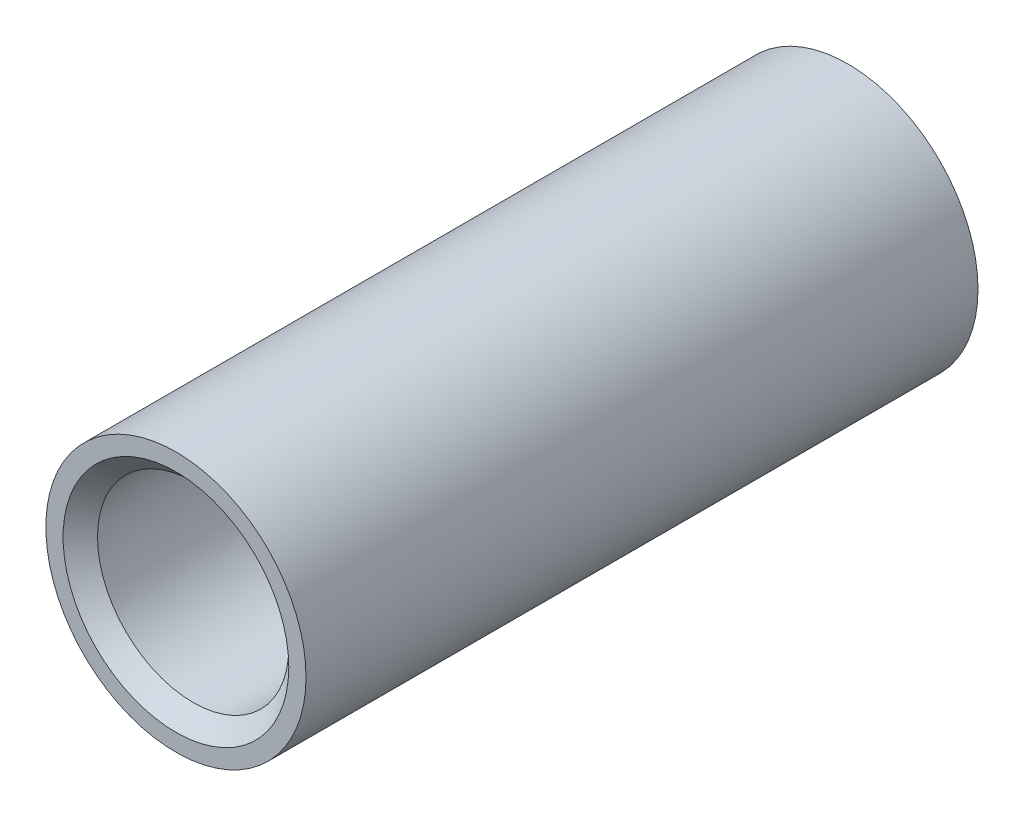
ISO-10303-21;
HEADER;
FILE_DESCRIPTION(('STEP AP214'),'2;1');
FILE_NAME('part.step','',(''),(''),'','','');
FILE_SCHEMA(('AUTOMOTIVE_DESIGN { 1 0 10303 214 1 1 1 1 }'));
ENDSEC;
DATA;
#1=APPLICATION_CONTEXT('core data for automotive mechanical design processes');
#2=APPLICATION_PROTOCOL_DEFINITION('international standard','automotive_design',2000,#1);
#3=PRODUCT_CONTEXT('',#1,'mechanical');
#4=PRODUCT('Part','Part','',(#3));
#5=PRODUCT_RELATED_PRODUCT_CATEGORY('part','',(#4));
#6=PRODUCT_DEFINITION_FORMATION('','',#4);
#7=PRODUCT_DEFINITION_CONTEXT('part definition',#1,'design');
#8=PRODUCT_DEFINITION('design','',#6,#7);
#9=PRODUCT_DEFINITION_SHAPE('','',#8);
#10=(LENGTH_UNIT() NAMED_UNIT(*) SI_UNIT(.MILLI.,.METRE.));
#11=(NAMED_UNIT(*) PLANE_ANGLE_UNIT() SI_UNIT($,.RADIAN.));
#12=(NAMED_UNIT(*) SI_UNIT($,.STERADIAN.) SOLID_ANGLE_UNIT());
#13=UNCERTAINTY_MEASURE_WITH_UNIT(LENGTH_MEASURE(1.E-05),#10,'distance_accuracy_value','');
#14=(GEOMETRIC_REPRESENTATION_CONTEXT(3) GLOBAL_UNCERTAINTY_ASSIGNED_CONTEXT((#13)) GLOBAL_UNIT_ASSIGNED_CONTEXT((#10,
#11,#12)) REPRESENTATION_CONTEXT('',''));
#15=CARTESIAN_POINT('',(0.,0.,0.));
#16=DIRECTION('',(0.,0.,1.));
#17=DIRECTION('',(1.,0.,0.));
#18=AXIS2_PLACEMENT_3D('',#15,#16,#17);
#19=CARTESIAN_POINT('',(0.,0.,-80.));
#20=DIRECTION('',(0.,0.,1.));
#21=DIRECTION('',(1.,0.,0.));
#22=AXIS2_PLACEMENT_3D('',#19,#20,#21);
#23=CYLINDRICAL_SURFACE('',#22,11.);
#24=CARTESIAN_POINT('',(0.,0.,0.));
#25=DIRECTION('',(0.,0.,1.));
#26=DIRECTION('',(1.,0.,0.));
#27=AXIS2_PLACEMENT_3D('',#24,#25,#26);
#28=CIRCLE('',#27,11.);
#29=CARTESIAN_POINT('',(11.,0.,0.));
#30=VERTEX_POINT('',#29);
#31=EDGE_CURVE('E67',#30,#30,#28,.T.);
#32=ORIENTED_EDGE('',*,*,#31,.T.);
#33=EDGE_LOOP('',(#32));
#34=FACE_BOUND('',#33,.T.);
#35=CARTESIAN_POINT('',(0.,0.,-37.));
#36=DIRECTION('',(0.,0.,-1.));
#37=DIRECTION('',(-1.,0.,0.));
#38=AXIS2_PLACEMENT_3D('',#35,#36,#37);
#39=CIRCLE('',#38,11.);
#40=CARTESIAN_POINT('',(-11.,0.,-37.));
#41=VERTEX_POINT('',#40);
#42=EDGE_CURVE('E75',#41,#41,#39,.T.);
#43=ORIENTED_EDGE('',*,*,#42,.T.);
#44=EDGE_LOOP('',(#43));
#45=FACE_BOUND('',#44,.T.);
#46=ADVANCED_FACE('F39',(#34,#45),#23,.F.);
#47=CARTESIAN_POINT('',(0.,0.,39.));
#48=DIRECTION('',(0.,0.,1.));
#49=DIRECTION('',(1.,0.,0.));
#50=AXIS2_PLACEMENT_3D('',#47,#48,#49);
#51=PLANE('',#50);
#52=CARTESIAN_POINT('',(0.,0.,39.));
#53=DIRECTION('',(0.,0.,1.));
#54=DIRECTION('',(1.,0.,0.));
#55=AXIS2_PLACEMENT_3D('',#52,#53,#54);
#56=CIRCLE('',#55,15.1);
#57=CARTESIAN_POINT('',(15.1,0.,39.));
#58=VERTEX_POINT('',#57);
#59=EDGE_CURVE('E10',#58,#58,#56,.T.);
#60=ORIENTED_EDGE('',*,*,#59,.T.);
#61=EDGE_LOOP('',(#60));
#62=FACE_BOUND('',#61,.T.);
#63=CARTESIAN_POINT('',(0.,0.,39.));
#64=DIRECTION('',(0.,0.,1.));
#65=DIRECTION('',(1.,0.,0.));
#66=AXIS2_PLACEMENT_3D('',#63,#64,#65);
#67=CIRCLE('',#66,13.1);
#68=CARTESIAN_POINT('',(13.1,0.,39.));
#69=VERTEX_POINT('',#68);
#70=EDGE_CURVE('E52',#69,#69,#67,.T.);
#71=ORIENTED_EDGE('',*,*,#70,.F.);
#72=EDGE_LOOP('',(#71));
#73=FACE_BOUND('',#72,.T.);
#74=ADVANCED_FACE('F94',(#62,#73),#51,.T.);
#75=CARTESIAN_POINT('',(0.,0.,0.));
#76=DIRECTION('',(0.,0.,1.));
#77=DIRECTION('',(1.,0.,0.));
#78=AXIS2_PLACEMENT_3D('',#75,#76,#77);
#79=CYLINDRICAL_SURFACE('',#78,11.1);
#80=CARTESIAN_POINT('',(0.,0.,0.));
#81=DIRECTION('',(0.,0.,1.));
#82=DIRECTION('',(1.,0.,0.));
#83=AXIS2_PLACEMENT_3D('',#80,#81,#82);
#84=CIRCLE('',#83,11.1);
#85=CARTESIAN_POINT('',(11.1,0.,0.));
#86=VERTEX_POINT('',#85);
#87=EDGE_CURVE('E47',#86,#86,#84,.T.);
#88=ORIENTED_EDGE('',*,*,#87,.F.);
#89=EDGE_LOOP('',(#88));
#90=FACE_BOUND('',#89,.T.);
#91=CARTESIAN_POINT('',(0.,0.,37.));
#92=DIRECTION('',(0.,0.,1.));
#93=DIRECTION('',(1.,0.,0.));
#94=AXIS2_PLACEMENT_3D('',#91,#92,#93);
#95=CIRCLE('',#94,11.1);
#96=CARTESIAN_POINT('',(11.1,0.,37.));
#97=VERTEX_POINT('',#96);
#98=EDGE_CURVE('E57',#97,#97,#95,.T.);
#99=ORIENTED_EDGE('',*,*,#98,.T.);
#100=EDGE_LOOP('',(#99));
#101=FACE_BOUND('',#100,.T.);
#102=ADVANCED_FACE('F99',(#90,#101),#79,.F.);
#103=CARTESIAN_POINT('',(0.,0.,39.));
#104=DIRECTION('',(0.,0.,-1.));
#105=DIRECTION('',(-1.,0.,0.));
#106=AXIS2_PLACEMENT_3D('',#103,#104,#105);
#107=CYLINDRICAL_SURFACE('',#106,15.1);
#108=ORIENTED_EDGE('',*,*,#59,.F.);
#109=EDGE_LOOP('',(#108));
#110=FACE_BOUND('',#109,.T.);
#111=CARTESIAN_POINT('',(0.,0.,-39.));
#112=DIRECTION('',(0.,0.,1.));
#113=DIRECTION('',(1.,0.,0.));
#114=AXIS2_PLACEMENT_3D('',#111,#112,#113);
#115=CIRCLE('',#114,15.1);
#116=CARTESIAN_POINT('',(15.1,0.,-39.));
#117=VERTEX_POINT('',#116);
#118=EDGE_CURVE('E63',#117,#117,#115,.T.);
#119=ORIENTED_EDGE('',*,*,#118,.T.);
#120=EDGE_LOOP('',(#119));
#121=FACE_BOUND('',#120,.T.);
#122=ADVANCED_FACE('F41',(#110,#121),#107,.T.);
#123=CARTESIAN_POINT('',(0.,0.,37.));
#124=DIRECTION('',(0.,0.,1.));
#125=DIRECTION('',(1.,0.,0.));
#126=AXIS2_PLACEMENT_3D('',#123,#124,#125);
#127=CONICAL_SURFACE('',#126,11.1,0.785398163397446);
#128=ORIENTED_EDGE('',*,*,#70,.T.);
#129=EDGE_LOOP('',(#128));
#130=FACE_BOUND('',#129,.T.);
#131=ORIENTED_EDGE('',*,*,#98,.F.);
#132=EDGE_LOOP('',(#131));
#133=FACE_BOUND('',#132,.T.);
#134=ADVANCED_FACE('F103',(#130,#133),#127,.F.);
#135=CARTESIAN_POINT('',(0.,0.,0.));
#136=DIRECTION('',(0.,0.,1.));
#137=DIRECTION('',(1.,0.,0.));
#138=AXIS2_PLACEMENT_3D('',#135,#136,#137);
#139=PLANE('',#138);
#140=ORIENTED_EDGE('',*,*,#31,.F.);
#141=EDGE_LOOP('',(#140));
#142=FACE_BOUND('',#141,.T.);
#143=ORIENTED_EDGE('',*,*,#87,.T.);
#144=EDGE_LOOP('',(#143));
#145=FACE_BOUND('',#144,.T.);
#146=ADVANCED_FACE('F89',(#142,#145),#139,.T.);
#147=CARTESIAN_POINT('',(0.,0.,-39.));
#148=DIRECTION('',(0.,0.,1.));
#149=DIRECTION('',(1.,0.,0.));
#150=AXIS2_PLACEMENT_3D('',#147,#148,#149);
#151=PLANE('',#150);
#152=CARTESIAN_POINT('',(0.,0.,-39.));
#153=DIRECTION('',(0.,0.,-1.));
#154=DIRECTION('',(-1.,0.,0.));
#155=AXIS2_PLACEMENT_3D('',#152,#153,#154);
#156=CIRCLE('',#155,13.);
#157=CARTESIAN_POINT('',(-13.,0.,-39.));
#158=VERTEX_POINT('',#157);
#159=EDGE_CURVE('E71',#158,#158,#156,.T.);
#160=ORIENTED_EDGE('',*,*,#159,.F.);
#161=EDGE_LOOP('',(#160));
#162=FACE_BOUND('',#161,.T.);
#163=ORIENTED_EDGE('',*,*,#118,.F.);
#164=EDGE_LOOP('',(#163));
#165=FACE_BOUND('',#164,.T.);
#166=ADVANCED_FACE('F83',(#162,#165),#151,.F.);
#167=CARTESIAN_POINT('',(0.,0.,-37.));
#168=DIRECTION('',(0.,0.,-1.));
#169=DIRECTION('',(-1.,0.,0.));
#170=AXIS2_PLACEMENT_3D('',#167,#168,#169);
#171=CONICAL_SURFACE('',#170,11.,0.785398163397448);
#172=ORIENTED_EDGE('',*,*,#159,.T.);
#173=EDGE_LOOP('',(#172));
#174=FACE_BOUND('',#173,.T.);
#175=ORIENTED_EDGE('',*,*,#42,.F.);
#176=EDGE_LOOP('',(#175));
#177=FACE_BOUND('',#176,.T.);
#178=ADVANCED_FACE('F81',(#174,#177),#171,.F.);
#179=CLOSED_SHELL('',(#46,#74,#102,#122,#134,#146,#166,#178));
#180=MANIFOLD_SOLID_BREP('B2',#179);
#181=ADVANCED_BREP_SHAPE_REPRESENTATION('',(#18,#180),#14);
#182=SHAPE_DEFINITION_REPRESENTATION(#9,#181);
ENDSEC;
END-ISO-10303-21;
